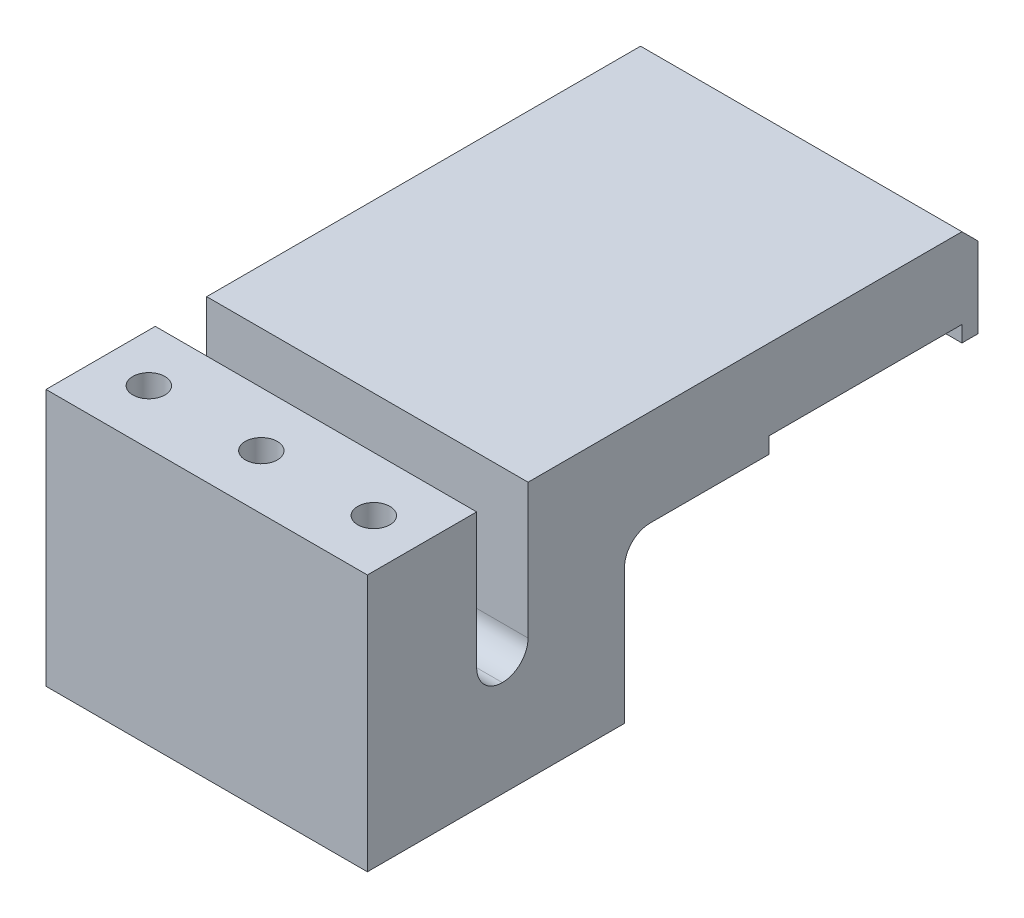
ISO-10303-21;
HEADER;
FILE_DESCRIPTION(('STEP AP214'),'2;1');
FILE_NAME('part.step','',(''),(''),'','','');
FILE_SCHEMA(('AUTOMOTIVE_DESIGN { 1 0 10303 214 1 1 1 1 }'));
ENDSEC;
DATA;
#1=APPLICATION_CONTEXT('core data for automotive mechanical design processes');
#2=APPLICATION_PROTOCOL_DEFINITION('international standard','automotive_design',2000,#1);
#3=PRODUCT_CONTEXT('',#1,'mechanical');
#4=PRODUCT('Part','Part','',(#3));
#5=PRODUCT_RELATED_PRODUCT_CATEGORY('part','',(#4));
#6=PRODUCT_DEFINITION_FORMATION('','',#4);
#7=PRODUCT_DEFINITION_CONTEXT('part definition',#1,'design');
#8=PRODUCT_DEFINITION('design','',#6,#7);
#9=PRODUCT_DEFINITION_SHAPE('','',#8);
#10=(LENGTH_UNIT() NAMED_UNIT(*) SI_UNIT(.MILLI.,.METRE.));
#11=(NAMED_UNIT(*) PLANE_ANGLE_UNIT() SI_UNIT($,.RADIAN.));
#12=(NAMED_UNIT(*) SI_UNIT($,.STERADIAN.) SOLID_ANGLE_UNIT());
#13=UNCERTAINTY_MEASURE_WITH_UNIT(LENGTH_MEASURE(1.E-05),#10,'distance_accuracy_value','');
#14=(GEOMETRIC_REPRESENTATION_CONTEXT(3) GLOBAL_UNCERTAINTY_ASSIGNED_CONTEXT((#13)) GLOBAL_UNIT_ASSIGNED_CONTEXT((#10,
#11,#12)) REPRESENTATION_CONTEXT('',''));
#15=CARTESIAN_POINT('',(0.,0.,0.));
#16=DIRECTION('',(0.,0.,1.));
#17=DIRECTION('',(1.,0.,0.));
#18=AXIS2_PLACEMENT_3D('',#15,#16,#17);
#19=CARTESIAN_POINT('',(0.,0.,0.));
#20=DIRECTION('',(0.,-1.,0.));
#21=DIRECTION('',(0.,0.,-1.));
#22=AXIS2_PLACEMENT_3D('',#19,#20,#21);
#23=PLANE('',#22);
#24=DIRECTION('',(-1.,0.,0.));
#25=VECTOR('',#24,1.);
#26=CARTESIAN_POINT('',(0.,0.,-5.));
#27=LINE('',#26,#25);
#28=CARTESIAN_POINT('',(50.,0.,-5.));
#29=VERTEX_POINT('',#28);
#30=CARTESIAN_POINT('',(-50.,0.,-5.));
#31=VERTEX_POINT('',#30);
#32=EDGE_CURVE('E320',#29,#31,#27,.T.);
#33=ORIENTED_EDGE('',*,*,#32,.F.);
#34=DIRECTION('',(0.,0.,-1.));
#35=VECTOR('',#34,1.);
#36=CARTESIAN_POINT('',(50.,0.,70.));
#37=LINE('',#36,#35);
#38=CARTESIAN_POINT('',(50.,0.,32.));
#39=VERTEX_POINT('',#38);
#40=EDGE_CURVE('E249',#39,#29,#37,.T.);
#41=ORIENTED_EDGE('',*,*,#40,.F.);
#42=DIRECTION('',(1.,0.,0.));
#43=VECTOR('',#42,1.);
#44=CARTESIAN_POINT('',(0.,0.,32.));
#45=LINE('',#44,#43);
#46=CARTESIAN_POINT('',(-50.,0.,32.));
#47=VERTEX_POINT('',#46);
#48=EDGE_CURVE('E290',#39,#47,#45,.F.);
#49=ORIENTED_EDGE('',*,*,#48,.T.);
#50=DIRECTION('',(0.,0.,1.));
#51=VECTOR('',#50,1.);
#52=CARTESIAN_POINT('',(-50.,0.,70.));
#53=LINE('',#52,#51);
#54=EDGE_CURVE('E259',#31,#47,#53,.T.);
#55=ORIENTED_EDGE('',*,*,#54,.F.);
#56=EDGE_LOOP('',(#33,#41,#49,#55));
#57=FACE_BOUND('',#56,.T.);
#58=ADVANCED_FACE('F17',(#57),#23,.T.);
#59=CARTESIAN_POINT('',(-50.,30.,70.));
#60=DIRECTION('',(0.,0.,-1.));
#61=DIRECTION('',(-1.,0.,0.));
#62=AXIS2_PLACEMENT_3D('',#59,#60,#61);
#63=PLANE('',#62);
#64=DIRECTION('',(0.,-1.,0.));
#65=VECTOR('',#64,1.);
#66=CARTESIAN_POINT('',(-50.,30.,70.));
#67=LINE('',#66,#65);
#68=CARTESIAN_POINT('',(-50.,30.,70.));
#69=VERTEX_POINT('',#68);
#70=CARTESIAN_POINT('',(-50.,-12.,70.));
#71=VERTEX_POINT('',#70);
#72=EDGE_CURVE('E282',#69,#71,#67,.T.);
#73=ORIENTED_EDGE('',*,*,#72,.T.);
#74=DIRECTION('',(-1.,0.,0.));
#75=VECTOR('',#74,1.);
#76=CARTESIAN_POINT('',(50.,-12.,70.));
#77=LINE('',#76,#75);
#78=CARTESIAN_POINT('',(50.,-12.,70.));
#79=VERTEX_POINT('',#78);
#80=EDGE_CURVE('E302',#71,#79,#77,.F.);
#81=ORIENTED_EDGE('',*,*,#80,.T.);
#82=DIRECTION('',(0.,-1.,0.));
#83=VECTOR('',#82,1.);
#84=CARTESIAN_POINT('',(50.,30.,70.));
#85=LINE('',#84,#83);
#86=CARTESIAN_POINT('',(50.,30.,70.));
#87=VERTEX_POINT('',#86);
#88=EDGE_CURVE('E242',#87,#79,#85,.T.);
#89=ORIENTED_EDGE('',*,*,#88,.F.);
#90=DIRECTION('',(1.,0.,0.));
#91=VECTOR('',#90,1.);
#92=CARTESIAN_POINT('',(-50.,30.,70.));
#93=LINE('',#92,#91);
#94=EDGE_CURVE('E240',#69,#87,#93,.T.);
#95=ORIENTED_EDGE('',*,*,#94,.F.);
#96=EDGE_LOOP('',(#73,#81,#89,#95));
#97=FACE_BOUND('',#96,.T.);
#98=ADVANCED_FACE('F344',(#97),#63,.F.);
#99=CARTESIAN_POINT('',(50.,30.,70.));
#100=DIRECTION('',(-1.,0.,0.));
#101=DIRECTION('',(0.,0.,1.));
#102=AXIS2_PLACEMENT_3D('',#99,#100,#101);
#103=PLANE('',#102);
#104=DIRECTION('',(0.,-1.,0.));
#105=VECTOR('',#104,1.);
#106=CARTESIAN_POINT('',(50.,30.,-70.));
#107=LINE('',#106,#105);
#108=CARTESIAN_POINT('',(50.,25.,-70.));
#109=VERTEX_POINT('',#108);
#110=CARTESIAN_POINT('',(50.,0.,-70.));
#111=VERTEX_POINT('',#110);
#112=EDGE_CURVE('E272',#109,#111,#107,.T.);
#113=ORIENTED_EDGE('',*,*,#112,.F.);
#114=DIRECTION('',(0.,-0.707106781186548,-0.707106781186548));
#115=VECTOR('',#114,1.);
#116=CARTESIAN_POINT('',(50.,30.,-65.));
#117=LINE('',#116,#115);
#118=CARTESIAN_POINT('',(50.,30.,-65.));
#119=VERTEX_POINT('',#118);
#120=EDGE_CURVE('E11',#109,#119,#117,.F.);
#121=ORIENTED_EDGE('',*,*,#120,.T.);
#122=DIRECTION('',(0.,0.,-1.));
#123=VECTOR('',#122,1.);
#124=CARTESIAN_POINT('',(50.,30.,70.));
#125=LINE('',#124,#123);
#126=EDGE_CURVE('E234',#87,#119,#125,.T.);
#127=ORIENTED_EDGE('',*,*,#126,.F.);
#128=ORIENTED_EDGE('',*,*,#88,.T.);
#129=CARTESIAN_POINT('',(50.,-12.,78.));
#130=DIRECTION('',(-1.,0.,0.));
#131=DIRECTION('',(0.,0.,1.));
#132=AXIS2_PLACEMENT_3D('',#129,#130,#131);
#133=CIRCLE('',#132,8.);
#134=CARTESIAN_POINT('',(50.,-20.,78.));
#135=VERTEX_POINT('',#134);
#136=EDGE_CURVE('E315',#79,#135,#133,.T.);
#137=ORIENTED_EDGE('',*,*,#136,.T.);
#138=CARTESIAN_POINT('',(50.,-12.,78.));
#139=DIRECTION('',(-1.,0.,0.));
#140=DIRECTION('',(0.,0.,1.));
#141=AXIS2_PLACEMENT_3D('',#138,#139,#140);
#142=CIRCLE('',#141,8.);
#143=CARTESIAN_POINT('',(50.,-12.,86.));
#144=VERTEX_POINT('',#143);
#145=EDGE_CURVE('E312',#135,#144,#142,.T.);
#146=ORIENTED_EDGE('',*,*,#145,.T.);
#147=DIRECTION('',(0.,-1.,0.));
#148=VECTOR('',#147,1.);
#149=CARTESIAN_POINT('',(50.,30.,86.));
#150=LINE('',#149,#148);
#151=CARTESIAN_POINT('',(50.,30.,86.));
#152=VERTEX_POINT('',#151);
#153=EDGE_CURVE('E216',#152,#144,#150,.T.);
#154=ORIENTED_EDGE('',*,*,#153,.F.);
#155=DIRECTION('',(0.,0.,-1.));
#156=VECTOR('',#155,1.);
#157=CARTESIAN_POINT('',(50.,30.,120.));
#158=LINE('',#157,#156);
#159=CARTESIAN_POINT('',(50.,30.,120.));
#160=VERTEX_POINT('',#159);
#161=EDGE_CURVE('E209',#160,#152,#158,.T.);
#162=ORIENTED_EDGE('',*,*,#161,.F.);
#163=DIRECTION('',(0.,1.,0.));
#164=VECTOR('',#163,1.);
#165=CARTESIAN_POINT('',(50.,-50.,120.));
#166=LINE('',#165,#164);
#167=CARTESIAN_POINT('',(50.,-50.,120.));
#168=VERTEX_POINT('',#167);
#169=EDGE_CURVE('E225',#168,#160,#166,.T.);
#170=ORIENTED_EDGE('',*,*,#169,.F.);
#171=DIRECTION('',(0.,0.,1.));
#172=VECTOR('',#171,1.);
#173=CARTESIAN_POINT('',(50.,-50.,70.));
#174=LINE('',#173,#172);
#175=CARTESIAN_POINT('',(50.,-50.,40.));
#176=VERTEX_POINT('',#175);
#177=EDGE_CURVE('E227',#176,#168,#174,.T.);
#178=ORIENTED_EDGE('',*,*,#177,.F.);
#179=DIRECTION('',(0.,1.,0.));
#180=VECTOR('',#179,1.);
#181=CARTESIAN_POINT('',(50.,-50.,40.));
#182=LINE('',#181,#180);
#183=CARTESIAN_POINT('',(50.,-8.,40.));
#184=VERTEX_POINT('',#183);
#185=EDGE_CURVE('E233',#176,#184,#182,.T.);
#186=ORIENTED_EDGE('',*,*,#185,.T.);
#187=CARTESIAN_POINT('',(50.,-8.,32.));
#188=DIRECTION('',(-1.,0.,0.));
#189=DIRECTION('',(0.,0.,1.));
#190=AXIS2_PLACEMENT_3D('',#187,#188,#189);
#191=CIRCLE('',#190,8.);
#192=EDGE_CURVE('E306',#184,#39,#191,.T.);
#193=ORIENTED_EDGE('',*,*,#192,.T.);
#194=ORIENTED_EDGE('',*,*,#40,.T.);
#195=DIRECTION('',(0.,1.,0.));
#196=VECTOR('',#195,1.);
#197=CARTESIAN_POINT('',(50.,30.,-5.));
#198=LINE('',#197,#196);
#199=CARTESIAN_POINT('',(50.,5.,-5.));
#200=VERTEX_POINT('',#199);
#201=EDGE_CURVE('E197',#29,#200,#198,.T.);
#202=ORIENTED_EDGE('',*,*,#201,.T.);
#203=DIRECTION('',(0.,0.,1.));
#204=VECTOR('',#203,1.);
#205=CARTESIAN_POINT('',(50.,5.,70.));
#206=LINE('',#205,#204);
#207=CARTESIAN_POINT('',(50.,5.,-65.));
#208=VERTEX_POINT('',#207);
#209=EDGE_CURVE('E200',#208,#200,#206,.T.);
#210=ORIENTED_EDGE('',*,*,#209,.F.);
#211=DIRECTION('',(0.,-1.,0.));
#212=VECTOR('',#211,1.);
#213=CARTESIAN_POINT('',(50.,30.,-65.));
#214=LINE('',#213,#212);
#215=CARTESIAN_POINT('',(50.,0.,-65.));
#216=VERTEX_POINT('',#215);
#217=EDGE_CURVE('E191',#208,#216,#214,.T.);
#218=ORIENTED_EDGE('',*,*,#217,.T.);
#219=EDGE_CURVE('E253',#216,#111,#37,.T.);
#220=ORIENTED_EDGE('',*,*,#219,.T.);
#221=EDGE_LOOP('',(#113,#121,#127,#128,#137,#146,#154,#162,#170,#178,#186,#193,#194,#202,#210,
#218,#220));
#222=FACE_BOUND('',#221,.T.);
#223=ADVANCED_FACE('F345',(#222),#103,.F.);
#224=CARTESIAN_POINT('',(-50.,30.,-70.));
#225=DIRECTION('',(0.,0.,1.));
#226=DIRECTION('',(1.,0.,0.));
#227=AXIS2_PLACEMENT_3D('',#224,#225,#226);
#228=PLANE('',#227);
#229=DIRECTION('',(0.,-1.,0.));
#230=VECTOR('',#229,1.);
#231=CARTESIAN_POINT('',(-50.,30.,-70.));
#232=LINE('',#231,#230);
#233=CARTESIAN_POINT('',(-50.,25.,-70.));
#234=VERTEX_POINT('',#233);
#235=CARTESIAN_POINT('',(-50.,0.,-70.));
#236=VERTEX_POINT('',#235);
#237=EDGE_CURVE('E285',#234,#236,#232,.T.);
#238=ORIENTED_EDGE('',*,*,#237,.F.);
#239=DIRECTION('',(1.,0.,0.));
#240=VECTOR('',#239,1.);
#241=CARTESIAN_POINT('',(-50.,25.,-70.));
#242=LINE('',#241,#240);
#243=EDGE_CURVE('E25',#234,#109,#242,.T.);
#244=ORIENTED_EDGE('',*,*,#243,.T.);
#245=ORIENTED_EDGE('',*,*,#112,.T.);
#246=DIRECTION('',(-1.,0.,0.));
#247=VECTOR('',#246,1.);
#248=CARTESIAN_POINT('',(-50.,0.,-70.));
#249=LINE('',#248,#247);
#250=EDGE_CURVE('E245',#111,#236,#249,.T.);
#251=ORIENTED_EDGE('',*,*,#250,.T.);
#252=EDGE_LOOP('',(#238,#244,#245,#251));
#253=FACE_BOUND('',#252,.T.);
#254=ADVANCED_FACE('F427',(#253),#228,.F.);
#255=CARTESIAN_POINT('',(-50.,30.,70.));
#256=DIRECTION('',(1.,0.,0.));
#257=DIRECTION('',(0.,0.,-1.));
#258=AXIS2_PLACEMENT_3D('',#255,#256,#257);
#259=PLANE('',#258);
#260=DIRECTION('',(0.,0.,1.));
#261=VECTOR('',#260,1.);
#262=CARTESIAN_POINT('',(-50.,30.,70.));
#263=LINE('',#262,#261);
#264=CARTESIAN_POINT('',(-50.,30.,-65.));
#265=VERTEX_POINT('',#264);
#266=EDGE_CURVE('E237',#265,#69,#263,.T.);
#267=ORIENTED_EDGE('',*,*,#266,.F.);
#268=DIRECTION('',(0.,0.707106781186548,0.707106781186548));
#269=VECTOR('',#268,1.);
#270=CARTESIAN_POINT('',(-50.,30.,-65.));
#271=LINE('',#270,#269);
#272=EDGE_CURVE('E39',#265,#234,#271,.F.);
#273=ORIENTED_EDGE('',*,*,#272,.T.);
#274=ORIENTED_EDGE('',*,*,#237,.T.);
#275=CARTESIAN_POINT('',(-50.,0.,-65.));
#276=VERTEX_POINT('',#275);
#277=EDGE_CURVE('E238',#236,#276,#53,.T.);
#278=ORIENTED_EDGE('',*,*,#277,.T.);
#279=DIRECTION('',(0.,1.,0.));
#280=VECTOR('',#279,1.);
#281=CARTESIAN_POINT('',(-50.,30.,-65.));
#282=LINE('',#281,#280);
#283=CARTESIAN_POINT('',(-50.,5.,-65.));
#284=VERTEX_POINT('',#283);
#285=EDGE_CURVE('E188',#276,#284,#282,.T.);
#286=ORIENTED_EDGE('',*,*,#285,.T.);
#287=DIRECTION('',(0.,0.,-1.));
#288=VECTOR('',#287,1.);
#289=CARTESIAN_POINT('',(-50.,5.,70.));
#290=LINE('',#289,#288);
#291=CARTESIAN_POINT('',(-50.,5.,-5.));
#292=VERTEX_POINT('',#291);
#293=EDGE_CURVE('E323',#292,#284,#290,.T.);
#294=ORIENTED_EDGE('',*,*,#293,.F.);
#295=DIRECTION('',(0.,-1.,0.));
#296=VECTOR('',#295,1.);
#297=CARTESIAN_POINT('',(-50.,30.,-5.));
#298=LINE('',#297,#296);
#299=EDGE_CURVE('E194',#292,#31,#298,.T.);
#300=ORIENTED_EDGE('',*,*,#299,.T.);
#301=ORIENTED_EDGE('',*,*,#54,.T.);
#302=CARTESIAN_POINT('',(-50.,-8.,32.));
#303=DIRECTION('',(1.,0.,0.));
#304=DIRECTION('',(0.,0.,-1.));
#305=AXIS2_PLACEMENT_3D('',#302,#303,#304);
#306=CIRCLE('',#305,8.);
#307=CARTESIAN_POINT('',(-50.,-8.,40.));
#308=VERTEX_POINT('',#307);
#309=EDGE_CURVE('E308',#47,#308,#306,.T.);
#310=ORIENTED_EDGE('',*,*,#309,.T.);
#311=DIRECTION('',(0.,1.,0.));
#312=VECTOR('',#311,1.);
#313=CARTESIAN_POINT('',(-50.,-50.,40.));
#314=LINE('',#313,#312);
#315=CARTESIAN_POINT('',(-50.,-50.,40.));
#316=VERTEX_POINT('',#315);
#317=EDGE_CURVE('E257',#316,#308,#314,.T.);
#318=ORIENTED_EDGE('',*,*,#317,.F.);
#319=DIRECTION('',(0.,0.,-1.));
#320=VECTOR('',#319,1.);
#321=CARTESIAN_POINT('',(-50.,-50.,70.));
#322=LINE('',#321,#320);
#323=CARTESIAN_POINT('',(-50.,-50.,120.));
#324=VERTEX_POINT('',#323);
#325=EDGE_CURVE('E229',#324,#316,#322,.T.);
#326=ORIENTED_EDGE('',*,*,#325,.F.);
#327=DIRECTION('',(0.,-1.,0.));
#328=VECTOR('',#327,1.);
#329=CARTESIAN_POINT('',(-50.,-50.,120.));
#330=LINE('',#329,#328);
#331=CARTESIAN_POINT('',(-50.,30.,120.));
#332=VERTEX_POINT('',#331);
#333=EDGE_CURVE('E219',#332,#324,#330,.T.);
#334=ORIENTED_EDGE('',*,*,#333,.F.);
#335=DIRECTION('',(0.,0.,1.));
#336=VECTOR('',#335,1.);
#337=CARTESIAN_POINT('',(-50.,30.,120.));
#338=LINE('',#337,#336);
#339=CARTESIAN_POINT('',(-50.,30.,86.));
#340=VERTEX_POINT('',#339);
#341=EDGE_CURVE('E203',#340,#332,#338,.T.);
#342=ORIENTED_EDGE('',*,*,#341,.F.);
#343=DIRECTION('',(0.,-1.,0.));
#344=VECTOR('',#343,1.);
#345=CARTESIAN_POINT('',(-50.,30.,86.));
#346=LINE('',#345,#344);
#347=CARTESIAN_POINT('',(-50.,-12.,86.));
#348=VERTEX_POINT('',#347);
#349=EDGE_CURVE('E213',#340,#348,#346,.T.);
#350=ORIENTED_EDGE('',*,*,#349,.T.);
#351=CARTESIAN_POINT('',(-50.,-12.,78.));
#352=DIRECTION('',(1.,0.,0.));
#353=DIRECTION('',(0.,0.,-1.));
#354=AXIS2_PLACEMENT_3D('',#351,#352,#353);
#355=CIRCLE('',#354,8.);
#356=CARTESIAN_POINT('',(-50.,-20.,78.));
#357=VERTEX_POINT('',#356);
#358=EDGE_CURVE('E310',#348,#357,#355,.T.);
#359=ORIENTED_EDGE('',*,*,#358,.T.);
#360=CARTESIAN_POINT('',(-50.,-12.,78.));
#361=DIRECTION('',(1.,0.,0.));
#362=DIRECTION('',(0.,0.,-1.));
#363=AXIS2_PLACEMENT_3D('',#360,#361,#362);
#364=CIRCLE('',#363,8.);
#365=EDGE_CURVE('E314',#357,#71,#364,.T.);
#366=ORIENTED_EDGE('',*,*,#365,.T.);
#367=ORIENTED_EDGE('',*,*,#72,.F.);
#368=EDGE_LOOP('',(#267,#273,#274,#278,#286,#294,#300,#301,#310,#318,#326,#334,#342,#350,#359,
#366,#367));
#369=FACE_BOUND('',#368,.T.);
#370=ADVANCED_FACE('F338',(#369),#259,.F.);
#371=CARTESIAN_POINT('',(0.,30.,0.));
#372=DIRECTION('',(0.,-1.,0.));
#373=DIRECTION('',(0.,0.,-1.));
#374=AXIS2_PLACEMENT_3D('',#371,#372,#373);
#375=PLANE('',#374);
#376=ORIENTED_EDGE('',*,*,#126,.T.);
#377=DIRECTION('',(-1.,0.,0.));
#378=VECTOR('',#377,1.);
#379=CARTESIAN_POINT('',(0.,30.,-65.));
#380=LINE('',#379,#378);
#381=EDGE_CURVE('E326',#119,#265,#380,.T.);
#382=ORIENTED_EDGE('',*,*,#381,.T.);
#383=ORIENTED_EDGE('',*,*,#266,.T.);
#384=ORIENTED_EDGE('',*,*,#94,.T.);
#385=EDGE_LOOP('',(#376,#382,#383,#384));
#386=FACE_BOUND('',#385,.T.);
#387=ADVANCED_FACE('F333',(#386),#375,.F.);
#388=DIRECTION('',(1.,0.,0.));
#389=VECTOR('',#388,1.);
#390=CARTESIAN_POINT('',(0.,0.,-65.));
#391=LINE('',#390,#389);
#392=EDGE_CURVE('E261',#276,#216,#391,.T.);
#393=ORIENTED_EDGE('',*,*,#392,.F.);
#394=ORIENTED_EDGE('',*,*,#277,.F.);
#395=ORIENTED_EDGE('',*,*,#250,.F.);
#396=ORIENTED_EDGE('',*,*,#219,.F.);
#397=EDGE_LOOP('',(#393,#394,#395,#396));
#398=FACE_BOUND('',#397,.T.);
#399=ADVANCED_FACE('F362',(#398),#23,.T.);
#400=CARTESIAN_POINT('',(50.,-50.,40.));
#401=DIRECTION('',(0.,0.,1.));
#402=DIRECTION('',(1.,0.,0.));
#403=AXIS2_PLACEMENT_3D('',#400,#401,#402);
#404=PLANE('',#403);
#405=ORIENTED_EDGE('',*,*,#317,.T.);
#406=DIRECTION('',(1.,0.,0.));
#407=VECTOR('',#406,1.);
#408=CARTESIAN_POINT('',(50.,-8.,40.));
#409=LINE('',#408,#407);
#410=EDGE_CURVE('E288',#308,#184,#409,.T.);
#411=ORIENTED_EDGE('',*,*,#410,.T.);
#412=ORIENTED_EDGE('',*,*,#185,.F.);
#413=DIRECTION('',(1.,0.,0.));
#414=VECTOR('',#413,1.);
#415=CARTESIAN_POINT('',(50.,-50.,40.));
#416=LINE('',#415,#414);
#417=EDGE_CURVE('E231',#316,#176,#416,.T.);
#418=ORIENTED_EDGE('',*,*,#417,.F.);
#419=EDGE_LOOP('',(#405,#411,#412,#418));
#420=FACE_BOUND('',#419,.T.);
#421=ADVANCED_FACE('F370',(#420),#404,.F.);
#422=CARTESIAN_POINT('',(0.,-50.,0.));
#423=DIRECTION('',(0.,1.,0.));
#424=DIRECTION('',(0.,0.,1.));
#425=AXIS2_PLACEMENT_3D('',#422,#423,#424);
#426=PLANE('',#425);
#427=ORIENTED_EDGE('',*,*,#177,.T.);
#428=DIRECTION('',(1.,0.,0.));
#429=VECTOR('',#428,1.);
#430=CARTESIAN_POINT('',(-50.,-50.,120.));
#431=LINE('',#430,#429);
#432=EDGE_CURVE('E222',#324,#168,#431,.T.);
#433=ORIENTED_EDGE('',*,*,#432,.F.);
#434=ORIENTED_EDGE('',*,*,#325,.T.);
#435=ORIENTED_EDGE('',*,*,#417,.T.);
#436=EDGE_LOOP('',(#427,#433,#434,#435));
#437=FACE_BOUND('',#436,.T.);
#438=ADVANCED_FACE('F377',(#437),#426,.F.);
#439=CARTESIAN_POINT('',(0.,0.,120.));
#440=DIRECTION('',(0.,0.,-1.));
#441=DIRECTION('',(-1.,0.,0.));
#442=AXIS2_PLACEMENT_3D('',#439,#440,#441);
#443=PLANE('',#442);
#444=ORIENTED_EDGE('',*,*,#333,.T.);
#445=ORIENTED_EDGE('',*,*,#432,.T.);
#446=ORIENTED_EDGE('',*,*,#169,.T.);
#447=DIRECTION('',(1.,0.,0.));
#448=VECTOR('',#447,1.);
#449=CARTESIAN_POINT('',(-50.,30.,120.));
#450=LINE('',#449,#448);
#451=EDGE_CURVE('E206',#332,#160,#450,.T.);
#452=ORIENTED_EDGE('',*,*,#451,.F.);
#453=EDGE_LOOP('',(#444,#445,#446,#452));
#454=FACE_BOUND('',#453,.T.);
#455=ADVANCED_FACE('F399',(#454),#443,.F.);
#456=CARTESIAN_POINT('',(-50.,30.,86.));
#457=DIRECTION('',(0.,0.,1.));
#458=DIRECTION('',(1.,0.,0.));
#459=AXIS2_PLACEMENT_3D('',#456,#457,#458);
#460=PLANE('',#459);
#461=ORIENTED_EDGE('',*,*,#153,.T.);
#462=DIRECTION('',(-1.,0.,0.));
#463=VECTOR('',#462,1.);
#464=CARTESIAN_POINT('',(-50.,-12.,86.));
#465=LINE('',#464,#463);
#466=EDGE_CURVE('E295',#144,#348,#465,.T.);
#467=ORIENTED_EDGE('',*,*,#466,.T.);
#468=ORIENTED_EDGE('',*,*,#349,.F.);
#469=DIRECTION('',(-1.,0.,0.));
#470=VECTOR('',#469,1.);
#471=CARTESIAN_POINT('',(-50.,30.,86.));
#472=LINE('',#471,#470);
#473=EDGE_CURVE('E211',#152,#340,#472,.T.);
#474=ORIENTED_EDGE('',*,*,#473,.F.);
#475=EDGE_LOOP('',(#461,#467,#468,#474));
#476=FACE_BOUND('',#475,.T.);
#477=ADVANCED_FACE('F408',(#476),#460,.F.);
#478=CARTESIAN_POINT('',(0.,30.,0.));
#479=DIRECTION('',(0.,-1.,0.));
#480=DIRECTION('',(0.,0.,-1.));
#481=AXIS2_PLACEMENT_3D('',#478,#479,#480);
#482=PLANE('',#481);
#483=CARTESIAN_POINT('',(-35.,30.,103.));
#484=DIRECTION('',(0.,1.,0.));
#485=DIRECTION('',(0.,0.,1.));
#486=AXIS2_PLACEMENT_3D('',#483,#484,#485);
#487=CIRCLE('',#486,5.);
#488=CARTESIAN_POINT('',(-35.,30.,108.));
#489=VERTEX_POINT('',#488);
#490=EDGE_CURVE('E664',#489,#489,#487,.T.);
#491=ORIENTED_EDGE('',*,*,#490,.F.);
#492=EDGE_LOOP('',(#491));
#493=FACE_BOUND('',#492,.T.);
#494=CARTESIAN_POINT('',(0.,30.,103.));
#495=DIRECTION('',(0.,1.,0.));
#496=DIRECTION('',(0.,0.,1.));
#497=AXIS2_PLACEMENT_3D('',#494,#495,#496);
#498=CIRCLE('',#497,5.);
#499=CARTESIAN_POINT('',(0.,30.,108.));
#500=VERTEX_POINT('',#499);
#501=EDGE_CURVE('E151',#500,#500,#498,.T.);
#502=ORIENTED_EDGE('',*,*,#501,.F.);
#503=EDGE_LOOP('',(#502));
#504=FACE_BOUND('',#503,.T.);
#505=CARTESIAN_POINT('',(35.,30.,103.));
#506=DIRECTION('',(0.,1.,0.));
#507=DIRECTION('',(0.,0.,1.));
#508=AXIS2_PLACEMENT_3D('',#505,#506,#507);
#509=CIRCLE('',#508,5.);
#510=CARTESIAN_POINT('',(35.,30.,108.));
#511=VERTEX_POINT('',#510);
#512=EDGE_CURVE('E170',#511,#511,#509,.T.);
#513=ORIENTED_EDGE('',*,*,#512,.F.);
#514=EDGE_LOOP('',(#513));
#515=FACE_BOUND('',#514,.T.);
#516=ORIENTED_EDGE('',*,*,#341,.T.);
#517=ORIENTED_EDGE('',*,*,#451,.T.);
#518=ORIENTED_EDGE('',*,*,#161,.T.);
#519=ORIENTED_EDGE('',*,*,#473,.T.);
#520=EDGE_LOOP('',(#516,#517,#518,#519));
#521=FACE_BOUND('',#520,.T.);
#522=ADVANCED_FACE('F404',(#493,#504,#515,#521),#482,.F.);
#523=CARTESIAN_POINT('',(50.,-8.,32.));
#524=DIRECTION('',(1.,0.,0.));
#525=DIRECTION('',(0.,0.,-1.));
#526=AXIS2_PLACEMENT_3D('',#523,#524,#525);
#527=CYLINDRICAL_SURFACE('',#526,8.);
#528=ORIENTED_EDGE('',*,*,#309,.F.);
#529=ORIENTED_EDGE('',*,*,#48,.F.);
#530=ORIENTED_EDGE('',*,*,#192,.F.);
#531=ORIENTED_EDGE('',*,*,#410,.F.);
#532=EDGE_LOOP('',(#528,#529,#530,#531));
#533=FACE_BOUND('',#532,.T.);
#534=ADVANCED_FACE('F392',(#533),#527,.F.);
#535=CARTESIAN_POINT('',(-50.,-12.,78.));
#536=DIRECTION('',(1.,0.,0.));
#537=DIRECTION('',(0.,0.,-1.));
#538=AXIS2_PLACEMENT_3D('',#535,#536,#537);
#539=CYLINDRICAL_SURFACE('',#538,8.);
#540=DIRECTION('',(-1.,0.,0.));
#541=VECTOR('',#540,1.);
#542=CARTESIAN_POINT('',(-50.,-20.,78.));
#543=LINE('',#542,#541);
#544=EDGE_CURVE('E202',#135,#357,#543,.T.);
#545=ORIENTED_EDGE('',*,*,#544,.F.);
#546=ORIENTED_EDGE('',*,*,#136,.F.);
#547=ORIENTED_EDGE('',*,*,#80,.F.);
#548=ORIENTED_EDGE('',*,*,#365,.F.);
#549=EDGE_LOOP('',(#545,#546,#547,#548));
#550=FACE_BOUND('',#549,.T.);
#551=ADVANCED_FACE('F415',(#550),#539,.F.);
#552=CARTESIAN_POINT('',(-50.,-12.,78.));
#553=DIRECTION('',(1.,0.,0.));
#554=DIRECTION('',(0.,0.,-1.));
#555=AXIS2_PLACEMENT_3D('',#552,#553,#554);
#556=CYLINDRICAL_SURFACE('',#555,8.);
#557=ORIENTED_EDGE('',*,*,#145,.F.);
#558=ORIENTED_EDGE('',*,*,#544,.T.);
#559=ORIENTED_EDGE('',*,*,#358,.F.);
#560=ORIENTED_EDGE('',*,*,#466,.F.);
#561=EDGE_LOOP('',(#557,#558,#559,#560));
#562=FACE_BOUND('',#561,.T.);
#563=ADVANCED_FACE('F412',(#562),#556,.F.);
#564=CARTESIAN_POINT('',(0.,5.,0.));
#565=DIRECTION('',(0.,-1.,0.));
#566=DIRECTION('',(0.,0.,-1.));
#567=AXIS2_PLACEMENT_3D('',#564,#565,#566);
#568=PLANE('',#567);
#569=ORIENTED_EDGE('',*,*,#209,.T.);
#570=DIRECTION('',(-1.,0.,0.));
#571=VECTOR('',#570,1.);
#572=CARTESIAN_POINT('',(-77.524117524708,5.,-5.));
#573=LINE('',#572,#571);
#574=EDGE_CURVE('E185',#200,#292,#573,.T.);
#575=ORIENTED_EDGE('',*,*,#574,.T.);
#576=ORIENTED_EDGE('',*,*,#293,.T.);
#577=DIRECTION('',(1.,0.,0.));
#578=VECTOR('',#577,1.);
#579=CARTESIAN_POINT('',(-77.524117524708,5.,-65.));
#580=LINE('',#579,#578);
#581=EDGE_CURVE('E182',#284,#208,#580,.T.);
#582=ORIENTED_EDGE('',*,*,#581,.T.);
#583=EDGE_LOOP('',(#569,#575,#576,#582));
#584=FACE_BOUND('',#583,.T.);
#585=ADVANCED_FACE('F386',(#584),#568,.T.);
#586=CARTESIAN_POINT('',(-77.524117524708,5.,-5.));
#587=DIRECTION('',(0.,0.,1.));
#588=DIRECTION('',(1.,0.,0.));
#589=AXIS2_PLACEMENT_3D('',#586,#587,#588);
#590=PLANE('',#589);
#591=ORIENTED_EDGE('',*,*,#32,.T.);
#592=ORIENTED_EDGE('',*,*,#299,.F.);
#593=ORIENTED_EDGE('',*,*,#574,.F.);
#594=ORIENTED_EDGE('',*,*,#201,.F.);
#595=EDGE_LOOP('',(#591,#592,#593,#594));
#596=FACE_BOUND('',#595,.T.);
#597=ADVANCED_FACE('F358',(#596),#590,.F.);
#598=CARTESIAN_POINT('',(-77.524117524708,5.,-65.));
#599=DIRECTION('',(0.,0.,-1.));
#600=DIRECTION('',(-1.,0.,0.));
#601=AXIS2_PLACEMENT_3D('',#598,#599,#600);
#602=PLANE('',#601);
#603=ORIENTED_EDGE('',*,*,#581,.F.);
#604=ORIENTED_EDGE('',*,*,#285,.F.);
#605=ORIENTED_EDGE('',*,*,#392,.T.);
#606=ORIENTED_EDGE('',*,*,#217,.F.);
#607=EDGE_LOOP('',(#603,#604,#605,#606));
#608=FACE_BOUND('',#607,.T.);
#609=ADVANCED_FACE('F348',(#608),#602,.F.);
#610=CARTESIAN_POINT('',(0.,30.,-65.));
#611=DIRECTION('',(0.,-0.707106781186548,0.707106781186548));
#612=DIRECTION('',(-1.,0.,0.));
#613=AXIS2_PLACEMENT_3D('',#610,#611,#612);
#614=PLANE('',#613);
#615=ORIENTED_EDGE('',*,*,#120,.F.);
#616=ORIENTED_EDGE('',*,*,#243,.F.);
#617=ORIENTED_EDGE('',*,*,#272,.F.);
#618=ORIENTED_EDGE('',*,*,#381,.F.);
#619=EDGE_LOOP('',(#615,#616,#617,#618));
#620=FACE_BOUND('',#619,.T.);
#621=ADVANCED_FACE('F19',(#620),#614,.F.);
#622=CARTESIAN_POINT('',(35.,2.5,103.));
#623=DIRECTION('',(0.,1.,0.));
#624=DIRECTION('',(0.,0.,1.));
#625=AXIS2_PLACEMENT_3D('',#622,#623,#624);
#626=CONICAL_SURFACE('',#625,4.25,1.02974425867665);
#627=CARTESIAN_POINT('',(35.,-0.0536576308671349,103.));
#628=VERTEX_POINT('',#627);
#629=VERTEX_LOOP('',#628);
#630=FACE_BOUND('',#629,.T.);
#631=CARTESIAN_POINT('',(35.,2.5,103.));
#632=DIRECTION('',(0.,1.,0.));
#633=DIRECTION('',(0.,0.,1.));
#634=AXIS2_PLACEMENT_3D('',#631,#632,#633);
#635=CIRCLE('',#634,4.25);
#636=CARTESIAN_POINT('',(35.,2.5,107.25));
#637=VERTEX_POINT('',#636);
#638=EDGE_CURVE('E179',#637,#637,#635,.T.);
#639=ORIENTED_EDGE('',*,*,#638,.T.);
#640=EDGE_LOOP('',(#639));
#641=FACE_BOUND('',#640,.T.);
#642=ADVANCED_FACE('F347',(#630,#641),#626,.F.);
#643=CARTESIAN_POINT('',(35.,30.,103.));
#644=DIRECTION('',(0.,1.,0.));
#645=DIRECTION('',(0.,0.,1.));
#646=AXIS2_PLACEMENT_3D('',#643,#644,#645);
#647=CYLINDRICAL_SURFACE('',#646,4.25);
#648=ORIENTED_EDGE('',*,*,#638,.F.);
#649=EDGE_LOOP('',(#648));
#650=FACE_BOUND('',#649,.T.);
#651=CARTESIAN_POINT('',(35.,10.,103.));
#652=DIRECTION('',(0.,1.,0.));
#653=DIRECTION('',(0.,0.,1.));
#654=AXIS2_PLACEMENT_3D('',#651,#652,#653);
#655=CIRCLE('',#654,4.25);
#656=CARTESIAN_POINT('',(35.,10.,107.25));
#657=VERTEX_POINT('',#656);
#658=EDGE_CURVE('E176',#657,#657,#655,.T.);
#659=ORIENTED_EDGE('',*,*,#658,.T.);
#660=EDGE_LOOP('',(#659));
#661=FACE_BOUND('',#660,.T.);
#662=ADVANCED_FACE('F355',(#650,#661),#647,.F.);
#663=CARTESIAN_POINT('',(39.25,10.,103.));
#664=DIRECTION('',(0.,-1.,0.));
#665=DIRECTION('',(0.,0.,-1.));
#666=AXIS2_PLACEMENT_3D('',#663,#664,#665);
#667=PLANE('',#666);
#668=ORIENTED_EDGE('',*,*,#658,.F.);
#669=EDGE_LOOP('',(#668));
#670=FACE_BOUND('',#669,.T.);
#671=CARTESIAN_POINT('',(35.,10.,103.));
#672=DIRECTION('',(0.,1.,0.));
#673=DIRECTION('',(0.,0.,1.));
#674=AXIS2_PLACEMENT_3D('',#671,#672,#673);
#675=CIRCLE('',#674,5.);
#676=CARTESIAN_POINT('',(35.,10.,108.));
#677=VERTEX_POINT('',#676);
#678=EDGE_CURVE('E173',#677,#677,#675,.T.);
#679=ORIENTED_EDGE('',*,*,#678,.T.);
#680=EDGE_LOOP('',(#679));
#681=FACE_BOUND('',#680,.T.);
#682=ADVANCED_FACE('F523',(#670,#681),#667,.F.);
#683=CARTESIAN_POINT('',(35.,30.,103.));
#684=DIRECTION('',(0.,1.,0.));
#685=DIRECTION('',(0.,0.,1.));
#686=AXIS2_PLACEMENT_3D('',#683,#684,#685);
#687=CYLINDRICAL_SURFACE('',#686,5.);
#688=ORIENTED_EDGE('',*,*,#678,.F.);
#689=EDGE_LOOP('',(#688));
#690=FACE_BOUND('',#689,.T.);
#691=ORIENTED_EDGE('',*,*,#512,.T.);
#692=EDGE_LOOP('',(#691));
#693=FACE_BOUND('',#692,.T.);
#694=ADVANCED_FACE('F531',(#690,#693),#687,.F.);
#695=CARTESIAN_POINT('',(0.,2.5,103.));
#696=DIRECTION('',(0.,1.,0.));
#697=DIRECTION('',(0.,0.,1.));
#698=AXIS2_PLACEMENT_3D('',#695,#696,#697);
#699=CONICAL_SURFACE('',#698,4.25,1.02974425867665);
#700=CARTESIAN_POINT('',(0.,-0.0536576308671349,103.));
#701=VERTEX_POINT('',#700);
#702=VERTEX_LOOP('',#701);
#703=FACE_BOUND('',#702,.T.);
#704=CARTESIAN_POINT('',(0.,2.5,103.));
#705=DIRECTION('',(0.,1.,0.));
#706=DIRECTION('',(0.,0.,1.));
#707=AXIS2_PLACEMENT_3D('',#704,#705,#706);
#708=CIRCLE('',#707,4.25);
#709=CARTESIAN_POINT('',(0.,2.5,107.25));
#710=VERTEX_POINT('',#709);
#711=EDGE_CURVE('E167',#710,#710,#708,.T.);
#712=ORIENTED_EDGE('',*,*,#711,.T.);
#713=EDGE_LOOP('',(#712));
#714=FACE_BOUND('',#713,.T.);
#715=ADVANCED_FACE('F539',(#703,#714),#699,.F.);
#716=CARTESIAN_POINT('',(0.,30.,103.));
#717=DIRECTION('',(0.,1.,0.));
#718=DIRECTION('',(0.,0.,1.));
#719=AXIS2_PLACEMENT_3D('',#716,#717,#718);
#720=CYLINDRICAL_SURFACE('',#719,4.25);
#721=ORIENTED_EDGE('',*,*,#711,.F.);
#722=EDGE_LOOP('',(#721));
#723=FACE_BOUND('',#722,.T.);
#724=CARTESIAN_POINT('',(0.,10.,103.));
#725=DIRECTION('',(0.,1.,0.));
#726=DIRECTION('',(0.,0.,1.));
#727=AXIS2_PLACEMENT_3D('',#724,#725,#726);
#728=CIRCLE('',#727,4.25);
#729=CARTESIAN_POINT('',(0.,10.,107.25));
#730=VERTEX_POINT('',#729);
#731=EDGE_CURVE('E164',#730,#730,#728,.T.);
#732=ORIENTED_EDGE('',*,*,#731,.T.);
#733=EDGE_LOOP('',(#732));
#734=FACE_BOUND('',#733,.T.);
#735=ADVANCED_FACE('F547',(#723,#734),#720,.F.);
#736=CARTESIAN_POINT('',(4.25,10.,103.));
#737=DIRECTION('',(0.,-1.,0.));
#738=DIRECTION('',(0.,0.,-1.));
#739=AXIS2_PLACEMENT_3D('',#736,#737,#738);
#740=PLANE('',#739);
#741=ORIENTED_EDGE('',*,*,#731,.F.);
#742=EDGE_LOOP('',(#741));
#743=FACE_BOUND('',#742,.T.);
#744=CARTESIAN_POINT('',(0.,10.,103.));
#745=DIRECTION('',(0.,1.,0.));
#746=DIRECTION('',(0.,0.,1.));
#747=AXIS2_PLACEMENT_3D('',#744,#745,#746);
#748=CIRCLE('',#747,5.);
#749=CARTESIAN_POINT('',(0.,10.,108.));
#750=VERTEX_POINT('',#749);
#751=EDGE_CURVE('E155',#750,#750,#748,.T.);
#752=ORIENTED_EDGE('',*,*,#751,.T.);
#753=EDGE_LOOP('',(#752));
#754=FACE_BOUND('',#753,.T.);
#755=ADVANCED_FACE('F555',(#743,#754),#740,.F.);
#756=CARTESIAN_POINT('',(0.,30.,103.));
#757=DIRECTION('',(0.,1.,0.));
#758=DIRECTION('',(0.,0.,1.));
#759=AXIS2_PLACEMENT_3D('',#756,#757,#758);
#760=CYLINDRICAL_SURFACE('',#759,5.);
#761=ORIENTED_EDGE('',*,*,#751,.F.);
#762=EDGE_LOOP('',(#761));
#763=FACE_BOUND('',#762,.T.);
#764=ORIENTED_EDGE('',*,*,#501,.T.);
#765=EDGE_LOOP('',(#764));
#766=FACE_BOUND('',#765,.T.);
#767=ADVANCED_FACE('F145',(#763,#766),#760,.F.);
#768=CARTESIAN_POINT('',(-35.,2.5,103.));
#769=DIRECTION('',(0.,1.,0.));
#770=DIRECTION('',(0.,0.,1.));
#771=AXIS2_PLACEMENT_3D('',#768,#769,#770);
#772=CONICAL_SURFACE('',#771,4.25,1.02974425867665);
#773=CARTESIAN_POINT('',(-35.,-0.0536576308671349,103.));
#774=VERTEX_POINT('',#773);
#775=VERTEX_LOOP('',#774);
#776=FACE_BOUND('',#775,.T.);
#777=CARTESIAN_POINT('',(-35.,2.5,103.));
#778=DIRECTION('',(0.,1.,0.));
#779=DIRECTION('',(0.,0.,1.));
#780=AXIS2_PLACEMENT_3D('',#777,#778,#779);
#781=CIRCLE('',#780,4.25);
#782=CARTESIAN_POINT('',(-35.,2.5,107.25));
#783=VERTEX_POINT('',#782);
#784=EDGE_CURVE('E149',#783,#783,#781,.T.);
#785=ORIENTED_EDGE('',*,*,#784,.T.);
#786=EDGE_LOOP('',(#785));
#787=FACE_BOUND('',#786,.T.);
#788=ADVANCED_FACE('F141',(#776,#787),#772,.F.);
#789=CARTESIAN_POINT('',(-35.,30.,103.));
#790=DIRECTION('',(0.,1.,0.));
#791=DIRECTION('',(0.,0.,1.));
#792=AXIS2_PLACEMENT_3D('',#789,#790,#791);
#793=CYLINDRICAL_SURFACE('',#792,4.25);
#794=ORIENTED_EDGE('',*,*,#784,.F.);
#795=EDGE_LOOP('',(#794));
#796=FACE_BOUND('',#795,.T.);
#797=CARTESIAN_POINT('',(-35.,10.,103.));
#798=DIRECTION('',(0.,1.,0.));
#799=DIRECTION('',(0.,0.,1.));
#800=AXIS2_PLACEMENT_3D('',#797,#798,#799);
#801=CIRCLE('',#800,4.25);
#802=CARTESIAN_POINT('',(-35.,10.,107.25));
#803=VERTEX_POINT('',#802);
#804=EDGE_CURVE('E152',#803,#803,#801,.T.);
#805=ORIENTED_EDGE('',*,*,#804,.T.);
#806=EDGE_LOOP('',(#805));
#807=FACE_BOUND('',#806,.T.);
#808=ADVANCED_FACE('F144',(#796,#807),#793,.F.);
#809=CARTESIAN_POINT('',(-30.75,10.,103.));
#810=DIRECTION('',(0.,-1.,0.));
#811=DIRECTION('',(0.,0.,-1.));
#812=AXIS2_PLACEMENT_3D('',#809,#810,#811);
#813=PLANE('',#812);
#814=ORIENTED_EDGE('',*,*,#804,.F.);
#815=EDGE_LOOP('',(#814));
#816=FACE_BOUND('',#815,.T.);
#817=CARTESIAN_POINT('',(-35.,10.,103.));
#818=DIRECTION('',(0.,1.,0.));
#819=DIRECTION('',(0.,0.,1.));
#820=AXIS2_PLACEMENT_3D('',#817,#818,#819);
#821=CIRCLE('',#820,5.);
#822=CARTESIAN_POINT('',(-35.,10.,108.));
#823=VERTEX_POINT('',#822);
#824=EDGE_CURVE('E158',#823,#823,#821,.T.);
#825=ORIENTED_EDGE('',*,*,#824,.T.);
#826=EDGE_LOOP('',(#825));
#827=FACE_BOUND('',#826,.T.);
#828=ADVANCED_FACE('F578',(#816,#827),#813,.F.);
#829=CARTESIAN_POINT('',(-35.,30.,103.));
#830=DIRECTION('',(0.,1.,0.));
#831=DIRECTION('',(0.,0.,1.));
#832=AXIS2_PLACEMENT_3D('',#829,#830,#831);
#833=CYLINDRICAL_SURFACE('',#832,5.);
#834=ORIENTED_EDGE('',*,*,#824,.F.);
#835=EDGE_LOOP('',(#834));
#836=FACE_BOUND('',#835,.T.);
#837=ORIENTED_EDGE('',*,*,#490,.T.);
#838=EDGE_LOOP('',(#837));
#839=FACE_BOUND('',#838,.T.);
#840=ADVANCED_FACE('F585',(#836,#839),#833,.F.);
#841=CLOSED_SHELL('',(#58,#98,#223,#254,#370,#387,#399,#421,#438,#455,#477,#522,#534,#551,#563,
#585,#597,#609,#621,#642,#662,#682,#694,#715,#735,#755,#767,#788,#808,#828,#840));
#842=MANIFOLD_SOLID_BREP('B1',#841);
#843=ADVANCED_BREP_SHAPE_REPRESENTATION('',(#18,#842),#14);
#844=SHAPE_DEFINITION_REPRESENTATION(#9,#843);
ENDSEC;
END-ISO-10303-21;
